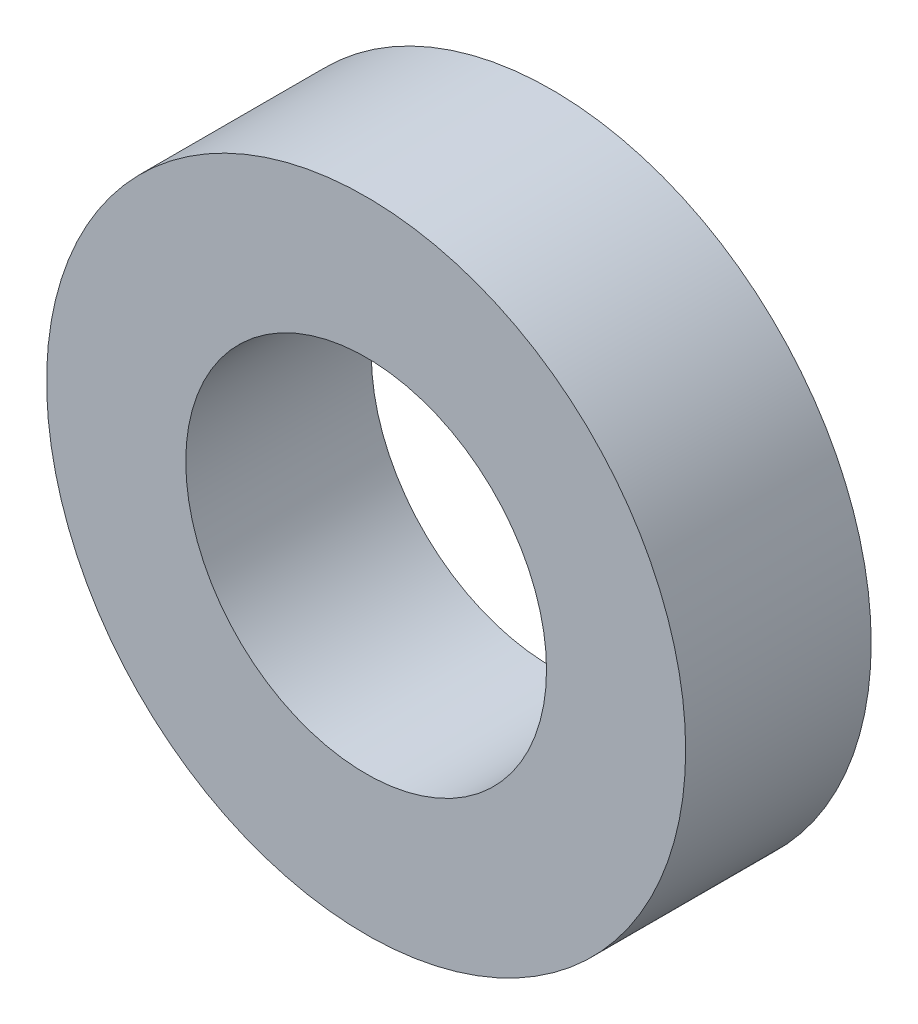
ISO-10303-21;
HEADER;
FILE_DESCRIPTION(('STEP AP214'),'2;1');
FILE_NAME('part.step','',(''),(''),'','','');
FILE_SCHEMA(('AUTOMOTIVE_DESIGN { 1 0 10303 214 1 1 1 1 }'));
ENDSEC;
DATA;
#1=APPLICATION_CONTEXT('core data for automotive mechanical design processes');
#2=APPLICATION_PROTOCOL_DEFINITION('international standard','automotive_design',2000,#1);
#3=PRODUCT_CONTEXT('',#1,'mechanical');
#4=PRODUCT('Part','Part','',(#3));
#5=PRODUCT_RELATED_PRODUCT_CATEGORY('part','',(#4));
#6=PRODUCT_DEFINITION_FORMATION('','',#4);
#7=PRODUCT_DEFINITION_CONTEXT('part definition',#1,'design');
#8=PRODUCT_DEFINITION('design','',#6,#7);
#9=PRODUCT_DEFINITION_SHAPE('','',#8);
#10=(LENGTH_UNIT() NAMED_UNIT(*) SI_UNIT(.MILLI.,.METRE.));
#11=(NAMED_UNIT(*) PLANE_ANGLE_UNIT() SI_UNIT($,.RADIAN.));
#12=(NAMED_UNIT(*) SI_UNIT($,.STERADIAN.) SOLID_ANGLE_UNIT());
#13=UNCERTAINTY_MEASURE_WITH_UNIT(LENGTH_MEASURE(1.E-05),#10,'distance_accuracy_value','');
#14=(GEOMETRIC_REPRESENTATION_CONTEXT(3) GLOBAL_UNCERTAINTY_ASSIGNED_CONTEXT((#13)) GLOBAL_UNIT_ASSIGNED_CONTEXT((#10,
#11,#12)) REPRESENTATION_CONTEXT('',''));
#15=CARTESIAN_POINT('',(0.,0.,0.));
#16=DIRECTION('',(0.,0.,1.));
#17=DIRECTION('',(1.,0.,0.));
#18=AXIS2_PLACEMENT_3D('',#15,#16,#17);
#19=CARTESIAN_POINT('',(0.,0.,18.));
#20=DIRECTION('',(0.,0.,1.));
#21=DIRECTION('',(1.,0.,0.));
#22=AXIS2_PLACEMENT_3D('',#19,#20,#21);
#23=PLANE('',#22);
#24=CARTESIAN_POINT('',(0.,0.,18.));
#25=DIRECTION('',(0.,0.,1.));
#26=DIRECTION('',(1.,0.,0.));
#27=AXIS2_PLACEMENT_3D('',#24,#25,#26);
#28=CIRCLE('',#27,31.);
#29=CARTESIAN_POINT('',(31.,0.,18.));
#30=VERTEX_POINT('',#29);
#31=EDGE_CURVE('E10',#30,#30,#28,.T.);
#32=ORIENTED_EDGE('',*,*,#31,.T.);
#33=EDGE_LOOP('',(#32));
#34=FACE_BOUND('',#33,.T.);
#35=CARTESIAN_POINT('',(0.,0.,18.));
#36=DIRECTION('',(0.,0.,1.));
#37=DIRECTION('',(1.,0.,0.));
#38=AXIS2_PLACEMENT_3D('',#35,#36,#37);
#39=CIRCLE('',#38,17.5);
#40=CARTESIAN_POINT('',(17.5,0.,18.));
#41=VERTEX_POINT('',#40);
#42=EDGE_CURVE('E50',#41,#41,#39,.T.);
#43=ORIENTED_EDGE('',*,*,#42,.F.);
#44=EDGE_LOOP('',(#43));
#45=FACE_BOUND('',#44,.T.);
#46=ADVANCED_FACE('F37',(#34,#45),#23,.T.);
#47=CARTESIAN_POINT('',(0.,0.,0.));
#48=DIRECTION('',(0.,0.,1.));
#49=DIRECTION('',(1.,0.,0.));
#50=AXIS2_PLACEMENT_3D('',#47,#48,#49);
#51=PLANE('',#50);
#52=CARTESIAN_POINT('',(0.,0.,0.));
#53=DIRECTION('',(0.,0.,1.));
#54=DIRECTION('',(1.,0.,0.));
#55=AXIS2_PLACEMENT_3D('',#52,#53,#54);
#56=CIRCLE('',#55,31.);
#57=CARTESIAN_POINT('',(31.,0.,0.));
#58=VERTEX_POINT('',#57);
#59=EDGE_CURVE('E41',#58,#58,#56,.T.);
#60=ORIENTED_EDGE('',*,*,#59,.F.);
#61=EDGE_LOOP('',(#60));
#62=FACE_BOUND('',#61,.T.);
#63=CARTESIAN_POINT('',(0.,0.,0.));
#64=DIRECTION('',(0.,0.,1.));
#65=DIRECTION('',(1.,0.,0.));
#66=AXIS2_PLACEMENT_3D('',#63,#64,#65);
#67=CIRCLE('',#66,17.5);
#68=CARTESIAN_POINT('',(17.5,0.,0.));
#69=VERTEX_POINT('',#68);
#70=EDGE_CURVE('E52',#69,#69,#67,.T.);
#71=ORIENTED_EDGE('',*,*,#70,.T.);
#72=EDGE_LOOP('',(#71));
#73=FACE_BOUND('',#72,.T.);
#74=ADVANCED_FACE('F64',(#62,#73),#51,.F.);
#75=CARTESIAN_POINT('',(0.,0.,18.));
#76=DIRECTION('',(0.,0.,-1.));
#77=DIRECTION('',(-1.,0.,0.));
#78=AXIS2_PLACEMENT_3D('',#75,#76,#77);
#79=CYLINDRICAL_SURFACE('',#78,31.);
#80=ORIENTED_EDGE('',*,*,#31,.F.);
#81=EDGE_LOOP('',(#80));
#82=FACE_BOUND('',#81,.T.);
#83=ORIENTED_EDGE('',*,*,#59,.T.);
#84=EDGE_LOOP('',(#83));
#85=FACE_BOUND('',#84,.T.);
#86=ADVANCED_FACE('F39',(#82,#85),#79,.T.);
#87=CARTESIAN_POINT('',(0.,0.,18.));
#88=DIRECTION('',(0.,0.,-1.));
#89=DIRECTION('',(-1.,0.,0.));
#90=AXIS2_PLACEMENT_3D('',#87,#88,#89);
#91=CYLINDRICAL_SURFACE('',#90,17.5);
#92=ORIENTED_EDGE('',*,*,#42,.T.);
#93=EDGE_LOOP('',(#92));
#94=FACE_BOUND('',#93,.T.);
#95=ORIENTED_EDGE('',*,*,#70,.F.);
#96=EDGE_LOOP('',(#95));
#97=FACE_BOUND('',#96,.T.);
#98=ADVANCED_FACE('F60',(#94,#97),#91,.F.);
#99=CLOSED_SHELL('',(#46,#74,#86,#98));
#100=MANIFOLD_SOLID_BREP('B2',#99);
#101=ADVANCED_BREP_SHAPE_REPRESENTATION('',(#18,#100),#14);
#102=SHAPE_DEFINITION_REPRESENTATION(#9,#101);
ENDSEC;
END-ISO-10303-21;
